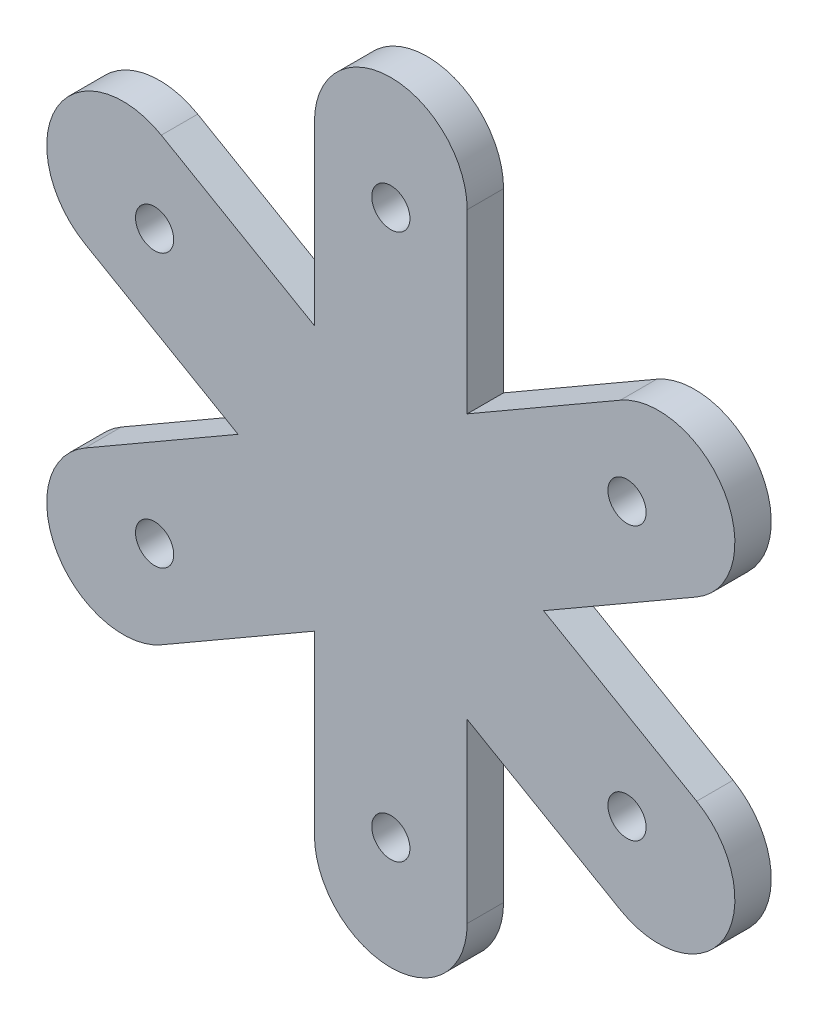
ISO-10303-21;
HEADER;
FILE_DESCRIPTION(('STEP AP214'),'2;1');
FILE_NAME('part.step','',(''),(''),'','','');
FILE_SCHEMA(('AUTOMOTIVE_DESIGN { 1 0 10303 214 1 1 1 1 }'));
ENDSEC;
DATA;
#1=APPLICATION_CONTEXT('core data for automotive mechanical design processes');
#2=APPLICATION_PROTOCOL_DEFINITION('international standard','automotive_design',2000,#1);
#3=PRODUCT_CONTEXT('',#1,'mechanical');
#4=PRODUCT('Part','Part','',(#3));
#5=PRODUCT_RELATED_PRODUCT_CATEGORY('part','',(#4));
#6=PRODUCT_DEFINITION_FORMATION('','',#4);
#7=PRODUCT_DEFINITION_CONTEXT('part definition',#1,'design');
#8=PRODUCT_DEFINITION('design','',#6,#7);
#9=PRODUCT_DEFINITION_SHAPE('','',#8);
#10=(LENGTH_UNIT() NAMED_UNIT(*) SI_UNIT(.MILLI.,.METRE.));
#11=(NAMED_UNIT(*) PLANE_ANGLE_UNIT() SI_UNIT($,.RADIAN.));
#12=(NAMED_UNIT(*) SI_UNIT($,.STERADIAN.) SOLID_ANGLE_UNIT());
#13=UNCERTAINTY_MEASURE_WITH_UNIT(LENGTH_MEASURE(1.E-05),#10,'distance_accuracy_value','');
#14=(GEOMETRIC_REPRESENTATION_CONTEXT(3) GLOBAL_UNCERTAINTY_ASSIGNED_CONTEXT((#13)) GLOBAL_UNIT_ASSIGNED_CONTEXT((#10,
#11,#12)) REPRESENTATION_CONTEXT('',''));
#15=CARTESIAN_POINT('',(0.,0.,0.));
#16=DIRECTION('',(0.,0.,1.));
#17=DIRECTION('',(1.,0.,0.));
#18=AXIS2_PLACEMENT_3D('',#15,#16,#17);
#19=CARTESIAN_POINT('',(-26.3060796608391,-45.5634665205264,10.));
#20=DIRECTION('',(0.50000000000001,0.866025403784433,0.));
#21=DIRECTION('',(-0.866025403784433,0.50000000000001,0.));
#22=AXIS2_PLACEMENT_3D('',#19,#20,#21);
#23=PLANE('',#22);
#24=DIRECTION('',(0.866025403784433,-0.50000000000001,0.));
#25=VECTOR('',#24,1.);
#26=CARTESIAN_POINT('',(-26.3060796608391,-45.5634665205264,0.));
#27=LINE('',#26,#25);
#28=CARTESIAN_POINT('',(-63.1121593216767,-24.3134665205265,0.));
#29=VERTEX_POINT('',#28);
#30=CARTESIAN_POINT('',(-21.,-48.6269330410536,0.));
#31=VERTEX_POINT('',#30);
#32=EDGE_CURVE('E217',#29,#31,#27,.T.);
#33=ORIENTED_EDGE('',*,*,#32,.F.);
#34=DIRECTION('',(0.,0.,-1.));
#35=VECTOR('',#34,1.);
#36=CARTESIAN_POINT('',(-63.1121593216767,-24.3134665205265,10.));
#37=LINE('',#36,#35);
#38=CARTESIAN_POINT('',(-63.1121593216767,-24.3134665205265,10.));
#39=VERTEX_POINT('',#38);
#40=EDGE_CURVE('E11',#39,#29,#37,.T.);
#41=ORIENTED_EDGE('',*,*,#40,.F.);
#42=DIRECTION('',(0.866025403784433,-0.50000000000001,0.));
#43=VECTOR('',#42,1.);
#44=CARTESIAN_POINT('',(-26.3060796608391,-45.5634665205264,10.));
#45=LINE('',#44,#43);
#46=CARTESIAN_POINT('',(-21.,-48.6269330410536,10.));
#47=VERTEX_POINT('',#46);
#48=EDGE_CURVE('E624',#39,#47,#45,.T.);
#49=ORIENTED_EDGE('',*,*,#48,.T.);
#50=DIRECTION('',(0.,0.,-1.));
#51=VECTOR('',#50,1.);
#52=CARTESIAN_POINT('',(-21.,-48.6269330410536,10.));
#53=LINE('',#52,#51);
#54=EDGE_CURVE('E123',#47,#31,#53,.T.);
#55=ORIENTED_EDGE('',*,*,#54,.T.);
#56=EDGE_LOOP('',(#33,#41,#49,#55));
#57=FACE_BOUND('',#56,.T.);
#58=ADVANCED_FACE('F41',(#57),#23,.T.);
#59=CARTESIAN_POINT('',(-73.6121593216769,-42.4999999999996,10.));
#60=DIRECTION('',(0.,0.,-1.));
#61=DIRECTION('',(-1.,0.,0.));
#62=AXIS2_PLACEMENT_3D('',#59,#60,#61);
#63=CYLINDRICAL_SURFACE('',#62,21.);
#64=CARTESIAN_POINT('',(-73.6121593216769,-42.4999999999996,0.));
#65=DIRECTION('',(0.,0.,1.));
#66=DIRECTION('',(1.,0.,0.));
#67=AXIS2_PLACEMENT_3D('',#64,#65,#66);
#68=CIRCLE('',#67,21.);
#69=CARTESIAN_POINT('',(-84.1121593216771,-60.6865334794727,0.));
#70=VERTEX_POINT('',#69);
#71=EDGE_CURVE('E219',#29,#70,#68,.T.);
#72=ORIENTED_EDGE('',*,*,#71,.T.);
#73=DIRECTION('',(0.,0.,-1.));
#74=VECTOR('',#73,1.);
#75=CARTESIAN_POINT('',(-84.1121593216771,-60.6865334794727,10.));
#76=LINE('',#75,#74);
#77=CARTESIAN_POINT('',(-84.1121593216771,-60.6865334794727,10.));
#78=VERTEX_POINT('',#77);
#79=EDGE_CURVE('E50',#78,#70,#76,.T.);
#80=ORIENTED_EDGE('',*,*,#79,.F.);
#81=CARTESIAN_POINT('',(-73.6121593216769,-42.4999999999996,10.));
#82=DIRECTION('',(0.,0.,1.));
#83=DIRECTION('',(1.,0.,0.));
#84=AXIS2_PLACEMENT_3D('',#81,#82,#83);
#85=CIRCLE('',#84,21.);
#86=EDGE_CURVE('E582',#39,#78,#85,.T.);
#87=ORIENTED_EDGE('',*,*,#86,.F.);
#88=ORIENTED_EDGE('',*,*,#40,.T.);
#89=EDGE_LOOP('',(#72,#80,#87,#88));
#90=FACE_BOUND('',#89,.T.);
#91=ADVANCED_FACE('F305',(#90),#63,.T.);
#92=CARTESIAN_POINT('',(-47.3060796608396,-81.9365334794726,10.));
#93=DIRECTION('',(0.50000000000001,0.866025403784433,0.));
#94=DIRECTION('',(-0.866025403784433,0.50000000000001,0.));
#95=AXIS2_PLACEMENT_3D('',#92,#93,#94);
#96=PLANE('',#95);
#97=DIRECTION('',(0.866025403784433,-0.50000000000001,0.));
#98=VECTOR('',#97,1.);
#99=CARTESIAN_POINT('',(-47.3060796608396,-81.9365334794726,0.));
#100=LINE('',#99,#98);
#101=CARTESIAN_POINT('',(-41.9999999999996,-85.0000000000002,0.));
#102=VERTEX_POINT('',#101);
#103=EDGE_CURVE('E222',#70,#102,#100,.T.);
#104=ORIENTED_EDGE('',*,*,#103,.T.);
#105=DIRECTION('',(0.,0.,-1.));
#106=VECTOR('',#105,1.);
#107=CARTESIAN_POINT('',(-41.9999999999996,-85.0000000000002,10.));
#108=LINE('',#107,#106);
#109=CARTESIAN_POINT('',(-41.9999999999996,-85.0000000000002,10.));
#110=VERTEX_POINT('',#109);
#111=EDGE_CURVE('E295',#110,#102,#108,.T.);
#112=ORIENTED_EDGE('',*,*,#111,.F.);
#113=DIRECTION('',(0.866025403784433,-0.50000000000001,0.));
#114=VECTOR('',#113,1.);
#115=CARTESIAN_POINT('',(-47.3060796608396,-81.9365334794726,10.));
#116=LINE('',#115,#114);
#117=EDGE_CURVE('E301',#78,#110,#116,.T.);
#118=ORIENTED_EDGE('',*,*,#117,.F.);
#119=ORIENTED_EDGE('',*,*,#79,.T.);
#120=EDGE_LOOP('',(#104,#112,#118,#119));
#121=FACE_BOUND('',#120,.T.);
#122=ADVANCED_FACE('F299',(#121),#96,.F.);
#123=CARTESIAN_POINT('',(26.3060796608388,-45.563466520528,10.));
#124=DIRECTION('',(-0.499999999999992,0.866025403784443,0.));
#125=DIRECTION('',(-0.866025403784443,-0.499999999999992,0.));
#126=AXIS2_PLACEMENT_3D('',#123,#124,#125);
#127=PLANE('',#126);
#128=DIRECTION('',(0.866025403784443,0.499999999999992,0.));
#129=VECTOR('',#128,1.);
#130=CARTESIAN_POINT('',(26.3060796608388,-45.563466520528,0.));
#131=LINE('',#130,#129);
#132=CARTESIAN_POINT('',(-84.1121593216773,-109.313466520527,0.));
#133=VERTEX_POINT('',#132);
#134=EDGE_CURVE('E225',#133,#102,#131,.T.);
#135=ORIENTED_EDGE('',*,*,#134,.F.);
#136=DIRECTION('',(0.,0.,-1.));
#137=VECTOR('',#136,1.);
#138=CARTESIAN_POINT('',(-84.1121593216773,-109.313466520527,10.));
#139=LINE('',#138,#137);
#140=CARTESIAN_POINT('',(-84.1121593216773,-109.313466520527,10.));
#141=VERTEX_POINT('',#140);
#142=EDGE_CURVE('E293',#141,#133,#139,.T.);
#143=ORIENTED_EDGE('',*,*,#142,.F.);
#144=DIRECTION('',(0.866025403784443,0.499999999999992,0.));
#145=VECTOR('',#144,1.);
#146=CARTESIAN_POINT('',(26.3060796608388,-45.563466520528,10.));
#147=LINE('',#146,#145);
#148=EDGE_CURVE('E579',#141,#110,#147,.T.);
#149=ORIENTED_EDGE('',*,*,#148,.T.);
#150=ORIENTED_EDGE('',*,*,#111,.T.);
#151=EDGE_LOOP('',(#135,#143,#149,#150));
#152=FACE_BOUND('',#151,.T.);
#153=ADVANCED_FACE('F415',(#152),#127,.T.);
#154=CARTESIAN_POINT('',(-73.6121593216775,-127.5,10.));
#155=DIRECTION('',(0.,0.,-1.));
#156=DIRECTION('',(-1.,0.,0.));
#157=AXIS2_PLACEMENT_3D('',#154,#155,#156);
#158=CYLINDRICAL_SURFACE('',#157,21.);
#159=CARTESIAN_POINT('',(-73.6121593216775,-127.5,0.));
#160=DIRECTION('',(0.,0.,1.));
#161=DIRECTION('',(1.,0.,0.));
#162=AXIS2_PLACEMENT_3D('',#159,#160,#161);
#163=CIRCLE('',#162,21.);
#164=CARTESIAN_POINT('',(-63.1121593216776,-145.686533479473,0.));
#165=VERTEX_POINT('',#164);
#166=EDGE_CURVE('E228',#133,#165,#163,.T.);
#167=ORIENTED_EDGE('',*,*,#166,.T.);
#168=DIRECTION('',(0.,0.,-1.));
#169=VECTOR('',#168,1.);
#170=CARTESIAN_POINT('',(-63.1121593216776,-145.686533479473,10.));
#171=LINE('',#170,#169);
#172=CARTESIAN_POINT('',(-63.1121593216776,-145.686533479473,10.));
#173=VERTEX_POINT('',#172);
#174=EDGE_CURVE('E290',#173,#165,#171,.T.);
#175=ORIENTED_EDGE('',*,*,#174,.F.);
#176=CARTESIAN_POINT('',(-73.6121593216775,-127.5,10.));
#177=DIRECTION('',(0.,0.,1.));
#178=DIRECTION('',(1.,0.,0.));
#179=AXIS2_PLACEMENT_3D('',#176,#177,#178);
#180=CIRCLE('',#179,21.);
#181=EDGE_CURVE('E576',#141,#173,#180,.T.);
#182=ORIENTED_EDGE('',*,*,#181,.F.);
#183=ORIENTED_EDGE('',*,*,#142,.T.);
#184=EDGE_LOOP('',(#167,#175,#182,#183));
#185=FACE_BOUND('',#184,.T.);
#186=ADVANCED_FACE('F411',(#185),#158,.T.);
#187=CARTESIAN_POINT('',(47.3060796608384,-81.9365334794746,10.));
#188=DIRECTION('',(-0.499999999999992,0.866025403784443,0.));
#189=DIRECTION('',(-0.866025403784443,-0.499999999999992,0.));
#190=AXIS2_PLACEMENT_3D('',#187,#188,#189);
#191=PLANE('',#190);
#192=DIRECTION('',(0.866025403784443,0.499999999999992,0.));
#193=VECTOR('',#192,1.);
#194=CARTESIAN_POINT('',(47.3060796608384,-81.9365334794746,0.));
#195=LINE('',#194,#193);
#196=CARTESIAN_POINT('',(-20.9999999999996,-121.373066958947,0.));
#197=VERTEX_POINT('',#196);
#198=EDGE_CURVE('E231',#165,#197,#195,.T.);
#199=ORIENTED_EDGE('',*,*,#198,.T.);
#200=DIRECTION('',(0.,0.,-1.));
#201=VECTOR('',#200,1.);
#202=CARTESIAN_POINT('',(-20.9999999999996,-121.373066958947,10.));
#203=LINE('',#202,#201);
#204=CARTESIAN_POINT('',(-20.9999999999996,-121.373066958947,10.));
#205=VERTEX_POINT('',#204);
#206=EDGE_CURVE('E288',#205,#197,#203,.T.);
#207=ORIENTED_EDGE('',*,*,#206,.F.);
#208=DIRECTION('',(0.866025403784443,0.499999999999992,0.));
#209=VECTOR('',#208,1.);
#210=CARTESIAN_POINT('',(47.3060796608384,-81.9365334794746,10.));
#211=LINE('',#210,#209);
#212=EDGE_CURVE('E578',#173,#205,#211,.T.);
#213=ORIENTED_EDGE('',*,*,#212,.F.);
#214=ORIENTED_EDGE('',*,*,#174,.T.);
#215=EDGE_LOOP('',(#199,#207,#213,#214));
#216=FACE_BOUND('',#215,.T.);
#217=ADVANCED_FACE('F407',(#216),#191,.F.);
#218=CARTESIAN_POINT('',(-20.9999999999988,1.45336401026207E-13,10.));
#219=DIRECTION('',(-1.,0.,0.));
#220=DIRECTION('',(0.,-1.,0.));
#221=AXIS2_PLACEMENT_3D('',#218,#219,#220);
#222=PLANE('',#221);
#223=DIRECTION('',(0.,1.,0.));
#224=VECTOR('',#223,1.);
#225=CARTESIAN_POINT('',(-20.9999999999988,1.45336401026207E-13,0.));
#226=LINE('',#225,#224);
#227=CARTESIAN_POINT('',(-21.,-170.,0.));
#228=VERTEX_POINT('',#227);
#229=EDGE_CURVE('E234',#228,#197,#226,.T.);
#230=ORIENTED_EDGE('',*,*,#229,.F.);
#231=DIRECTION('',(0.,0.,-1.));
#232=VECTOR('',#231,1.);
#233=CARTESIAN_POINT('',(-21.,-170.,10.));
#234=LINE('',#233,#232);
#235=CARTESIAN_POINT('',(-21.,-170.,10.));
#236=VERTEX_POINT('',#235);
#237=EDGE_CURVE('E286',#236,#228,#234,.T.);
#238=ORIENTED_EDGE('',*,*,#237,.F.);
#239=DIRECTION('',(0.,1.,0.));
#240=VECTOR('',#239,1.);
#241=CARTESIAN_POINT('',(-20.9999999999988,1.45336401026207E-13,10.));
#242=LINE('',#241,#240);
#243=EDGE_CURVE('E587',#236,#205,#242,.T.);
#244=ORIENTED_EDGE('',*,*,#243,.T.);
#245=ORIENTED_EDGE('',*,*,#206,.T.);
#246=EDGE_LOOP('',(#230,#238,#244,#245));
#247=FACE_BOUND('',#246,.T.);
#248=ADVANCED_FACE('F403',(#247),#222,.T.);
#249=CARTESIAN_POINT('',(0.,-170.000000000001,10.));
#250=DIRECTION('',(0.,0.,-1.));
#251=DIRECTION('',(-1.,0.,0.));
#252=AXIS2_PLACEMENT_3D('',#249,#250,#251);
#253=CYLINDRICAL_SURFACE('',#252,21.);
#254=CARTESIAN_POINT('',(0.,-170.000000000001,0.));
#255=DIRECTION('',(0.,0.,1.));
#256=DIRECTION('',(1.,0.,0.));
#257=AXIS2_PLACEMENT_3D('',#254,#255,#256);
#258=CIRCLE('',#257,21.);
#259=CARTESIAN_POINT('',(21.,-170.000000000001,0.));
#260=VERTEX_POINT('',#259);
#261=EDGE_CURVE('E237',#228,#260,#258,.T.);
#262=ORIENTED_EDGE('',*,*,#261,.T.);
#263=DIRECTION('',(0.,0.,-1.));
#264=VECTOR('',#263,1.);
#265=CARTESIAN_POINT('',(21.,-170.000000000001,10.));
#266=LINE('',#265,#264);
#267=CARTESIAN_POINT('',(21.,-170.000000000001,10.));
#268=VERTEX_POINT('',#267);
#269=EDGE_CURVE('E283',#268,#260,#266,.T.);
#270=ORIENTED_EDGE('',*,*,#269,.F.);
#271=CARTESIAN_POINT('',(0.,-170.000000000001,10.));
#272=DIRECTION('',(0.,0.,1.));
#273=DIRECTION('',(1.,0.,0.));
#274=AXIS2_PLACEMENT_3D('',#271,#272,#273);
#275=CIRCLE('',#274,21.);
#276=EDGE_CURVE('E590',#236,#268,#275,.T.);
#277=ORIENTED_EDGE('',*,*,#276,.F.);
#278=ORIENTED_EDGE('',*,*,#237,.T.);
#279=EDGE_LOOP('',(#262,#270,#277,#278));
#280=FACE_BOUND('',#279,.T.);
#281=ADVANCED_FACE('F399',(#280),#253,.T.);
#282=CARTESIAN_POINT('',(21.0000000000012,-1.45336401026223E-13,10.));
#283=DIRECTION('',(-1.,0.,0.));
#284=DIRECTION('',(0.,-1.,0.));
#285=AXIS2_PLACEMENT_3D('',#282,#283,#284);
#286=PLANE('',#285);
#287=DIRECTION('',(0.,1.,0.));
#288=VECTOR('',#287,1.);
#289=CARTESIAN_POINT('',(21.0000000000012,-1.45336401026223E-13,0.));
#290=LINE('',#289,#288);
#291=CARTESIAN_POINT('',(21.0000000000004,-121.373066958947,0.));
#292=VERTEX_POINT('',#291);
#293=EDGE_CURVE('E240',#260,#292,#290,.T.);
#294=ORIENTED_EDGE('',*,*,#293,.T.);
#295=DIRECTION('',(0.,0.,-1.));
#296=VECTOR('',#295,1.);
#297=CARTESIAN_POINT('',(21.0000000000004,-121.373066958947,10.));
#298=LINE('',#297,#296);
#299=CARTESIAN_POINT('',(21.0000000000004,-121.373066958947,10.));
#300=VERTEX_POINT('',#299);
#301=EDGE_CURVE('E281',#300,#292,#298,.T.);
#302=ORIENTED_EDGE('',*,*,#301,.F.);
#303=DIRECTION('',(0.,1.,0.));
#304=VECTOR('',#303,1.);
#305=CARTESIAN_POINT('',(21.0000000000012,-1.45336401026223E-13,10.));
#306=LINE('',#305,#304);
#307=EDGE_CURVE('E593',#268,#300,#306,.T.);
#308=ORIENTED_EDGE('',*,*,#307,.F.);
#309=ORIENTED_EDGE('',*,*,#269,.T.);
#310=EDGE_LOOP('',(#294,#302,#308,#309));
#311=FACE_BOUND('',#310,.T.);
#312=ADVANCED_FACE('F395',(#311),#286,.F.);
#313=CARTESIAN_POINT('',(-47.3060796608388,-81.9365334794727,10.));
#314=DIRECTION('',(-0.500000000000004,-0.866025403784436,0.));
#315=DIRECTION('',(0.866025403784436,-0.500000000000004,0.));
#316=AXIS2_PLACEMENT_3D('',#313,#314,#315);
#317=PLANE('',#316);
#318=DIRECTION('',(-0.866025403784436,0.500000000000004,0.));
#319=VECTOR('',#318,1.);
#320=CARTESIAN_POINT('',(-47.3060796608388,-81.9365334794727,0.));
#321=LINE('',#320,#319);
#322=CARTESIAN_POINT('',(63.1121593216778,-145.686533479474,0.));
#323=VERTEX_POINT('',#322);
#324=EDGE_CURVE('E243',#323,#292,#321,.T.);
#325=ORIENTED_EDGE('',*,*,#324,.F.);
#326=DIRECTION('',(0.,0.,-1.));
#327=VECTOR('',#326,1.);
#328=CARTESIAN_POINT('',(63.1121593216778,-145.686533479474,10.));
#329=LINE('',#328,#327);
#330=CARTESIAN_POINT('',(63.1121593216778,-145.686533479474,10.));
#331=VERTEX_POINT('',#330);
#332=EDGE_CURVE('E279',#331,#323,#329,.T.);
#333=ORIENTED_EDGE('',*,*,#332,.F.);
#334=DIRECTION('',(-0.866025403784436,0.500000000000004,0.));
#335=VECTOR('',#334,1.);
#336=CARTESIAN_POINT('',(-47.3060796608388,-81.9365334794727,10.));
#337=LINE('',#336,#335);
#338=EDGE_CURVE('E595',#331,#300,#337,.T.);
#339=ORIENTED_EDGE('',*,*,#338,.T.);
#340=ORIENTED_EDGE('',*,*,#301,.T.);
#341=EDGE_LOOP('',(#325,#333,#339,#340));
#342=FACE_BOUND('',#341,.T.);
#343=ADVANCED_FACE('F391',(#342),#317,.T.);
#344=CARTESIAN_POINT('',(73.6121593216779,-127.500000000001,10.));
#345=DIRECTION('',(0.,0.,-1.));
#346=DIRECTION('',(-1.,0.,0.));
#347=AXIS2_PLACEMENT_3D('',#344,#345,#346);
#348=CYLINDRICAL_SURFACE('',#347,21.);
#349=CARTESIAN_POINT('',(73.6121593216779,-127.500000000001,0.));
#350=DIRECTION('',(0.,0.,1.));
#351=DIRECTION('',(1.,0.,0.));
#352=AXIS2_PLACEMENT_3D('',#349,#350,#351);
#353=CIRCLE('',#352,21.);
#354=CARTESIAN_POINT('',(84.112159321678,-109.313466520527,0.));
#355=VERTEX_POINT('',#354);
#356=EDGE_CURVE('E246',#323,#355,#353,.T.);
#357=ORIENTED_EDGE('',*,*,#356,.T.);
#358=DIRECTION('',(0.,0.,-1.));
#359=VECTOR('',#358,1.);
#360=CARTESIAN_POINT('',(84.112159321678,-109.313466520527,10.));
#361=LINE('',#360,#359);
#362=CARTESIAN_POINT('',(84.112159321678,-109.313466520527,10.));
#363=VERTEX_POINT('',#362);
#364=EDGE_CURVE('E276',#363,#355,#361,.T.);
#365=ORIENTED_EDGE('',*,*,#364,.F.);
#366=CARTESIAN_POINT('',(73.6121593216779,-127.500000000001,10.));
#367=DIRECTION('',(0.,0.,1.));
#368=DIRECTION('',(1.,0.,0.));
#369=AXIS2_PLACEMENT_3D('',#366,#367,#368);
#370=CIRCLE('',#369,21.);
#371=EDGE_CURVE('E598',#331,#363,#370,.T.);
#372=ORIENTED_EDGE('',*,*,#371,.F.);
#373=ORIENTED_EDGE('',*,*,#332,.T.);
#374=EDGE_LOOP('',(#357,#365,#372,#373));
#375=FACE_BOUND('',#374,.T.);
#376=ADVANCED_FACE('F387',(#375),#348,.T.);
#377=CARTESIAN_POINT('',(-26.3060796608387,-45.5634665205263,10.));
#378=DIRECTION('',(-0.500000000000004,-0.866025403784436,0.));
#379=DIRECTION('',(0.866025403784436,-0.500000000000004,0.));
#380=AXIS2_PLACEMENT_3D('',#377,#378,#379);
#381=PLANE('',#380);
#382=DIRECTION('',(-0.866025403784436,0.500000000000004,0.));
#383=VECTOR('',#382,1.);
#384=CARTESIAN_POINT('',(-26.3060796608387,-45.5634665205263,0.));
#385=LINE('',#384,#383);
#386=CARTESIAN_POINT('',(42.0000000000003,-85.0000000000001,0.));
#387=VERTEX_POINT('',#386);
#388=EDGE_CURVE('E249',#355,#387,#385,.T.);
#389=ORIENTED_EDGE('',*,*,#388,.T.);
#390=DIRECTION('',(0.,0.,-1.));
#391=VECTOR('',#390,1.);
#392=CARTESIAN_POINT('',(42.0000000000003,-85.0000000000001,10.));
#393=LINE('',#392,#391);
#394=CARTESIAN_POINT('',(42.0000000000003,-85.0000000000001,10.));
#395=VERTEX_POINT('',#394);
#396=EDGE_CURVE('E274',#395,#387,#393,.T.);
#397=ORIENTED_EDGE('',*,*,#396,.F.);
#398=DIRECTION('',(-0.866025403784436,0.500000000000004,0.));
#399=VECTOR('',#398,1.);
#400=CARTESIAN_POINT('',(-26.3060796608387,-45.5634665205263,10.));
#401=LINE('',#400,#399);
#402=EDGE_CURVE('E601',#363,#395,#401,.T.);
#403=ORIENTED_EDGE('',*,*,#402,.F.);
#404=ORIENTED_EDGE('',*,*,#364,.T.);
#405=EDGE_LOOP('',(#389,#397,#403,#404));
#406=FACE_BOUND('',#405,.T.);
#407=ADVANCED_FACE('F383',(#406),#381,.F.);
#408=CARTESIAN_POINT('',(47.3060796608386,-81.9365334794735,10.));
#409=DIRECTION('',(0.499999999999998,-0.86602540378444,0.));
#410=DIRECTION('',(0.86602540378444,0.499999999999998,0.));
#411=AXIS2_PLACEMENT_3D('',#408,#409,#410);
#412=PLANE('',#411);
#413=DIRECTION('',(-0.86602540378444,-0.499999999999998,0.));
#414=VECTOR('',#413,1.);
#415=CARTESIAN_POINT('',(47.3060796608386,-81.9365334794735,0.));
#416=LINE('',#415,#414);
#417=CARTESIAN_POINT('',(84.1121593216778,-60.6865334794733,0.));
#418=VERTEX_POINT('',#417);
#419=EDGE_CURVE('E252',#418,#387,#416,.T.);
#420=ORIENTED_EDGE('',*,*,#419,.F.);
#421=DIRECTION('',(0.,0.,-1.));
#422=VECTOR('',#421,1.);
#423=CARTESIAN_POINT('',(84.1121593216778,-60.6865334794733,10.));
#424=LINE('',#423,#422);
#425=CARTESIAN_POINT('',(84.1121593216778,-60.6865334794733,10.));
#426=VERTEX_POINT('',#425);
#427=EDGE_CURVE('E272',#426,#418,#424,.T.);
#428=ORIENTED_EDGE('',*,*,#427,.F.);
#429=DIRECTION('',(-0.86602540378444,-0.499999999999998,0.));
#430=VECTOR('',#429,1.);
#431=CARTESIAN_POINT('',(47.3060796608386,-81.9365334794735,10.));
#432=LINE('',#431,#430);
#433=EDGE_CURVE('E603',#426,#395,#432,.T.);
#434=ORIENTED_EDGE('',*,*,#433,.T.);
#435=ORIENTED_EDGE('',*,*,#396,.T.);
#436=EDGE_LOOP('',(#420,#428,#434,#435));
#437=FACE_BOUND('',#436,.T.);
#438=ADVANCED_FACE('F379',(#437),#412,.T.);
#439=CARTESIAN_POINT('',(73.6121593216778,-42.5000000000001,10.));
#440=DIRECTION('',(0.,0.,-1.));
#441=DIRECTION('',(-1.,0.,0.));
#442=AXIS2_PLACEMENT_3D('',#439,#440,#441);
#443=CYLINDRICAL_SURFACE('',#442,21.);
#444=CARTESIAN_POINT('',(73.6121593216778,-42.5000000000001,0.));
#445=DIRECTION('',(0.,0.,1.));
#446=DIRECTION('',(1.,0.,0.));
#447=AXIS2_PLACEMENT_3D('',#444,#445,#446);
#448=CIRCLE('',#447,21.);
#449=CARTESIAN_POINT('',(63.1121593216779,-24.3134665205268,0.));
#450=VERTEX_POINT('',#449);
#451=EDGE_CURVE('E255',#418,#450,#448,.T.);
#452=ORIENTED_EDGE('',*,*,#451,.T.);
#453=DIRECTION('',(0.,0.,-1.));
#454=VECTOR('',#453,1.);
#455=CARTESIAN_POINT('',(63.1121593216779,-24.3134665205268,10.));
#456=LINE('',#455,#454);
#457=CARTESIAN_POINT('',(63.1121593216779,-24.3134665205268,10.));
#458=VERTEX_POINT('',#457);
#459=EDGE_CURVE('E269',#458,#450,#456,.T.);
#460=ORIENTED_EDGE('',*,*,#459,.F.);
#461=CARTESIAN_POINT('',(73.6121593216778,-42.5000000000001,10.));
#462=DIRECTION('',(0.,0.,1.));
#463=DIRECTION('',(1.,0.,0.));
#464=AXIS2_PLACEMENT_3D('',#461,#462,#463);
#465=CIRCLE('',#464,21.);
#466=EDGE_CURVE('E194',#426,#458,#465,.T.);
#467=ORIENTED_EDGE('',*,*,#466,.F.);
#468=ORIENTED_EDGE('',*,*,#427,.T.);
#469=EDGE_LOOP('',(#452,#460,#467,#468));
#470=FACE_BOUND('',#469,.T.);
#471=ADVANCED_FACE('F375',(#470),#443,.T.);
#472=CARTESIAN_POINT('',(26.3060796608387,-45.563466520527,10.));
#473=DIRECTION('',(0.499999999999998,-0.86602540378444,0.));
#474=DIRECTION('',(0.86602540378444,0.499999999999998,0.));
#475=AXIS2_PLACEMENT_3D('',#472,#473,#474);
#476=PLANE('',#475);
#477=DIRECTION('',(-0.86602540378444,-0.499999999999998,0.));
#478=VECTOR('',#477,1.);
#479=CARTESIAN_POINT('',(26.3060796608387,-45.563466520527,0.));
#480=LINE('',#479,#478);
#481=CARTESIAN_POINT('',(21.,-48.6269330410538,0.));
#482=VERTEX_POINT('',#481);
#483=EDGE_CURVE('E258',#450,#482,#480,.T.);
#484=ORIENTED_EDGE('',*,*,#483,.T.);
#485=DIRECTION('',(0.,0.,-1.));
#486=VECTOR('',#485,1.);
#487=CARTESIAN_POINT('',(21.,-48.6269330410538,10.));
#488=LINE('',#487,#486);
#489=CARTESIAN_POINT('',(21.,-48.6269330410538,10.));
#490=VERTEX_POINT('',#489);
#491=EDGE_CURVE('E182',#490,#482,#488,.T.);
#492=ORIENTED_EDGE('',*,*,#491,.F.);
#493=DIRECTION('',(-0.86602540378444,-0.499999999999998,0.));
#494=VECTOR('',#493,1.);
#495=CARTESIAN_POINT('',(26.3060796608387,-45.563466520527,10.));
#496=LINE('',#495,#494);
#497=EDGE_CURVE('E191',#458,#490,#496,.T.);
#498=ORIENTED_EDGE('',*,*,#497,.F.);
#499=ORIENTED_EDGE('',*,*,#459,.T.);
#500=EDGE_LOOP('',(#484,#492,#498,#499));
#501=FACE_BOUND('',#500,.T.);
#502=ADVANCED_FACE('F372',(#501),#476,.F.);
#503=CARTESIAN_POINT('',(21.,0.,10.));
#504=DIRECTION('',(1.,0.,0.));
#505=DIRECTION('',(0.,1.,0.));
#506=AXIS2_PLACEMENT_3D('',#503,#504,#505);
#507=PLANE('',#506);
#508=DIRECTION('',(0.,-1.,0.));
#509=VECTOR('',#508,1.);
#510=CARTESIAN_POINT('',(21.,0.,0.));
#511=LINE('',#510,#509);
#512=CARTESIAN_POINT('',(21.,0.,0.));
#513=VERTEX_POINT('',#512);
#514=EDGE_CURVE('E179',#513,#482,#511,.T.);
#515=ORIENTED_EDGE('',*,*,#514,.F.);
#516=DIRECTION('',(0.,0.,-1.));
#517=VECTOR('',#516,1.);
#518=CARTESIAN_POINT('',(21.,0.,10.));
#519=LINE('',#518,#517);
#520=CARTESIAN_POINT('',(21.,0.,10.));
#521=VERTEX_POINT('',#520);
#522=EDGE_CURVE('E173',#521,#513,#519,.T.);
#523=ORIENTED_EDGE('',*,*,#522,.F.);
#524=DIRECTION('',(0.,-1.,0.));
#525=VECTOR('',#524,1.);
#526=CARTESIAN_POINT('',(21.,0.,10.));
#527=LINE('',#526,#525);
#528=EDGE_CURVE('E177',#521,#490,#527,.T.);
#529=ORIENTED_EDGE('',*,*,#528,.T.);
#530=ORIENTED_EDGE('',*,*,#491,.T.);
#531=EDGE_LOOP('',(#515,#523,#529,#530));
#532=FACE_BOUND('',#531,.T.);
#533=ADVANCED_FACE('F175',(#532),#507,.T.);
#534=CARTESIAN_POINT('',(0.,0.,10.));
#535=DIRECTION('',(0.,0.,-1.));
#536=DIRECTION('',(-1.,0.,0.));
#537=AXIS2_PLACEMENT_3D('',#534,#535,#536);
#538=CYLINDRICAL_SURFACE('',#537,21.);
#539=CARTESIAN_POINT('',(0.,0.,0.));
#540=DIRECTION('',(0.,0.,1.));
#541=DIRECTION('',(1.,0.,0.));
#542=AXIS2_PLACEMENT_3D('',#539,#540,#541);
#543=CIRCLE('',#542,21.);
#544=CARTESIAN_POINT('',(-21.,0.,0.));
#545=VERTEX_POINT('',#544);
#546=EDGE_CURVE('E262',#513,#545,#543,.T.);
#547=ORIENTED_EDGE('',*,*,#546,.T.);
#548=DIRECTION('',(0.,0.,-1.));
#549=VECTOR('',#548,1.);
#550=CARTESIAN_POINT('',(-21.,0.,10.));
#551=LINE('',#550,#549);
#552=CARTESIAN_POINT('',(-21.,0.,10.));
#553=VERTEX_POINT('',#552);
#554=EDGE_CURVE('E183',#553,#545,#551,.T.);
#555=ORIENTED_EDGE('',*,*,#554,.F.);
#556=CARTESIAN_POINT('',(0.,0.,10.));
#557=DIRECTION('',(0.,0.,1.));
#558=DIRECTION('',(1.,0.,0.));
#559=AXIS2_PLACEMENT_3D('',#556,#557,#558);
#560=CIRCLE('',#559,21.);
#561=EDGE_CURVE('E186',#521,#553,#560,.T.);
#562=ORIENTED_EDGE('',*,*,#561,.F.);
#563=ORIENTED_EDGE('',*,*,#522,.T.);
#564=EDGE_LOOP('',(#547,#555,#562,#563));
#565=FACE_BOUND('',#564,.T.);
#566=ADVANCED_FACE('F187',(#565),#538,.T.);
#567=CARTESIAN_POINT('',(64.9519052838346,-47.4999999999974,10.));
#568=DIRECTION('',(0.,0.,-1.));
#569=DIRECTION('',(-1.,0.,0.));
#570=AXIS2_PLACEMENT_3D('',#567,#568,#569);
#571=CYLINDRICAL_SURFACE('',#570,5.25);
#572=CARTESIAN_POINT('',(64.9519052838346,-47.4999999999974,10.));
#573=DIRECTION('',(0.,0.,1.));
#574=DIRECTION('',(1.,0.,0.));
#575=AXIS2_PLACEMENT_3D('',#572,#573,#574);
#576=CIRCLE('',#575,5.25);
#577=CARTESIAN_POINT('',(70.2019052838346,-47.4999999999974,10.));
#578=VERTEX_POINT('',#577);
#579=EDGE_CURVE('E626',#578,#578,#576,.T.);
#580=ORIENTED_EDGE('',*,*,#579,.T.);
#581=EDGE_LOOP('',(#580));
#582=FACE_BOUND('',#581,.T.);
#583=CARTESIAN_POINT('',(64.9519052838346,-47.4999999999974,0.));
#584=DIRECTION('',(0.,0.,1.));
#585=DIRECTION('',(1.,0.,0.));
#586=AXIS2_PLACEMENT_3D('',#583,#584,#585);
#587=CIRCLE('',#586,5.25);
#588=CARTESIAN_POINT('',(70.2019052838346,-47.4999999999974,0.));
#589=VERTEX_POINT('',#588);
#590=EDGE_CURVE('E214',#589,#589,#587,.T.);
#591=ORIENTED_EDGE('',*,*,#590,.F.);
#592=EDGE_LOOP('',(#591));
#593=FACE_BOUND('',#592,.T.);
#594=ADVANCED_FACE('F315',(#582,#593),#571,.F.);
#595=CARTESIAN_POINT('',(64.9519052838375,-122.499999999998,10.));
#596=DIRECTION('',(0.,0.,-1.));
#597=DIRECTION('',(-1.,0.,0.));
#598=AXIS2_PLACEMENT_3D('',#595,#596,#597);
#599=CYLINDRICAL_SURFACE('',#598,5.25);
#600=CARTESIAN_POINT('',(64.9519052838375,-122.499999999998,10.));
#601=DIRECTION('',(0.,0.,1.));
#602=DIRECTION('',(1.,0.,0.));
#603=AXIS2_PLACEMENT_3D('',#600,#601,#602);
#604=CIRCLE('',#603,5.25);
#605=CARTESIAN_POINT('',(70.2019052838375,-122.499999999998,10.));
#606=VERTEX_POINT('',#605);
#607=EDGE_CURVE('E629',#606,#606,#604,.T.);
#608=ORIENTED_EDGE('',*,*,#607,.T.);
#609=EDGE_LOOP('',(#608));
#610=FACE_BOUND('',#609,.T.);
#611=CARTESIAN_POINT('',(64.9519052838375,-122.499999999998,0.));
#612=DIRECTION('',(0.,0.,1.));
#613=DIRECTION('',(1.,0.,0.));
#614=AXIS2_PLACEMENT_3D('',#611,#612,#613);
#615=CIRCLE('',#614,5.25);
#616=CARTESIAN_POINT('',(70.2019052838375,-122.499999999998,0.));
#617=VERTEX_POINT('',#616);
#618=EDGE_CURVE('E211',#617,#617,#615,.T.);
#619=ORIENTED_EDGE('',*,*,#618,.F.);
#620=EDGE_LOOP('',(#619));
#621=FACE_BOUND('',#620,.T.);
#622=ADVANCED_FACE('F318',(#610,#621),#599,.F.);
#623=CARTESIAN_POINT('',(5.83564766383916E-12,-160.,10.));
#624=DIRECTION('',(0.,0.,-1.));
#625=DIRECTION('',(-1.,0.,0.));
#626=AXIS2_PLACEMENT_3D('',#623,#624,#625);
#627=CYLINDRICAL_SURFACE('',#626,5.25);
#628=CARTESIAN_POINT('',(5.83564766383916E-12,-160.,10.));
#629=DIRECTION('',(0.,0.,1.));
#630=DIRECTION('',(1.,0.,0.));
#631=AXIS2_PLACEMENT_3D('',#628,#629,#630);
#632=CIRCLE('',#631,5.25);
#633=CARTESIAN_POINT('',(5.25000000000584,-160.,10.));
#634=VERTEX_POINT('',#633);
#635=EDGE_CURVE('E632',#634,#634,#632,.T.);
#636=ORIENTED_EDGE('',*,*,#635,.T.);
#637=EDGE_LOOP('',(#636));
#638=FACE_BOUND('',#637,.T.);
#639=CARTESIAN_POINT('',(5.83564766383916E-12,-160.,0.));
#640=DIRECTION('',(0.,0.,1.));
#641=DIRECTION('',(1.,0.,0.));
#642=AXIS2_PLACEMENT_3D('',#639,#640,#641);
#643=CIRCLE('',#642,5.25);
#644=CARTESIAN_POINT('',(5.25000000000584,-160.,0.));
#645=VERTEX_POINT('',#644);
#646=EDGE_CURVE('E208',#645,#645,#643,.T.);
#647=ORIENTED_EDGE('',*,*,#646,.F.);
#648=EDGE_LOOP('',(#647));
#649=FACE_BOUND('',#648,.T.);
#650=ADVANCED_FACE('F322',(#638,#649),#627,.F.);
#651=CARTESIAN_POINT('',(-64.9519052838285,-122.500000000002,10.));
#652=DIRECTION('',(0.,0.,-1.));
#653=DIRECTION('',(-1.,0.,0.));
#654=AXIS2_PLACEMENT_3D('',#651,#652,#653);
#655=CYLINDRICAL_SURFACE('',#654,5.25);
#656=CARTESIAN_POINT('',(-64.9519052838285,-122.500000000002,10.));
#657=DIRECTION('',(0.,0.,1.));
#658=DIRECTION('',(1.,0.,0.));
#659=AXIS2_PLACEMENT_3D('',#656,#657,#658);
#660=CIRCLE('',#659,5.25);
#661=CARTESIAN_POINT('',(-59.7019052838284,-122.500000000002,10.));
#662=VERTEX_POINT('',#661);
#663=EDGE_CURVE('E635',#662,#662,#660,.T.);
#664=ORIENTED_EDGE('',*,*,#663,.T.);
#665=EDGE_LOOP('',(#664));
#666=FACE_BOUND('',#665,.T.);
#667=CARTESIAN_POINT('',(-64.9519052838285,-122.500000000002,0.));
#668=DIRECTION('',(0.,0.,1.));
#669=DIRECTION('',(1.,0.,0.));
#670=AXIS2_PLACEMENT_3D('',#667,#668,#669);
#671=CIRCLE('',#670,5.25);
#672=CARTESIAN_POINT('',(-59.7019052838284,-122.500000000002,0.));
#673=VERTEX_POINT('',#672);
#674=EDGE_CURVE('E205',#673,#673,#671,.T.);
#675=ORIENTED_EDGE('',*,*,#674,.F.);
#676=EDGE_LOOP('',(#675));
#677=FACE_BOUND('',#676,.T.);
#678=ADVANCED_FACE('F326',(#666,#677),#655,.F.);
#679=CARTESIAN_POINT('',(-64.9519052838309,-47.500000000002,10.));
#680=DIRECTION('',(0.,0.,-1.));
#681=DIRECTION('',(-1.,0.,0.));
#682=AXIS2_PLACEMENT_3D('',#679,#680,#681);
#683=CYLINDRICAL_SURFACE('',#682,5.25);
#684=CARTESIAN_POINT('',(-64.9519052838309,-47.500000000002,10.));
#685=DIRECTION('',(0.,0.,1.));
#686=DIRECTION('',(1.,0.,0.));
#687=AXIS2_PLACEMENT_3D('',#684,#685,#686);
#688=CIRCLE('',#687,5.25);
#689=CARTESIAN_POINT('',(-59.7019052838309,-47.500000000002,10.));
#690=VERTEX_POINT('',#689);
#691=EDGE_CURVE('E341',#690,#690,#688,.T.);
#692=ORIENTED_EDGE('',*,*,#691,.T.);
#693=EDGE_LOOP('',(#692));
#694=FACE_BOUND('',#693,.T.);
#695=CARTESIAN_POINT('',(-64.9519052838309,-47.500000000002,0.));
#696=DIRECTION('',(0.,0.,1.));
#697=DIRECTION('',(1.,0.,0.));
#698=AXIS2_PLACEMENT_3D('',#695,#696,#697);
#699=CIRCLE('',#698,5.25);
#700=CARTESIAN_POINT('',(-59.7019052838309,-47.500000000002,0.));
#701=VERTEX_POINT('',#700);
#702=EDGE_CURVE('E202',#701,#701,#699,.T.);
#703=ORIENTED_EDGE('',*,*,#702,.F.);
#704=EDGE_LOOP('',(#703));
#705=FACE_BOUND('',#704,.T.);
#706=ADVANCED_FACE('F329',(#694,#705),#683,.F.);
#707=CARTESIAN_POINT('',(0.,-10.,10.));
#708=DIRECTION('',(0.,0.,-1.));
#709=DIRECTION('',(-1.,0.,0.));
#710=AXIS2_PLACEMENT_3D('',#707,#708,#709);
#711=CYLINDRICAL_SURFACE('',#710,5.25);
#712=CARTESIAN_POINT('',(0.,-10.,10.));
#713=DIRECTION('',(0.,0.,1.));
#714=DIRECTION('',(1.,0.,0.));
#715=AXIS2_PLACEMENT_3D('',#712,#713,#714);
#716=CIRCLE('',#715,5.25);
#717=CARTESIAN_POINT('',(5.25,-10.,10.));
#718=VERTEX_POINT('',#717);
#719=EDGE_CURVE('E265',#718,#718,#716,.T.);
#720=ORIENTED_EDGE('',*,*,#719,.T.);
#721=EDGE_LOOP('',(#720));
#722=FACE_BOUND('',#721,.T.);
#723=CARTESIAN_POINT('',(0.,-10.,0.));
#724=DIRECTION('',(0.,0.,1.));
#725=DIRECTION('',(1.,0.,0.));
#726=AXIS2_PLACEMENT_3D('',#723,#724,#725);
#727=CIRCLE('',#726,5.25);
#728=CARTESIAN_POINT('',(5.25,-10.,0.));
#729=VERTEX_POINT('',#728);
#730=EDGE_CURVE('E199',#729,#729,#727,.T.);
#731=ORIENTED_EDGE('',*,*,#730,.F.);
#732=EDGE_LOOP('',(#731));
#733=FACE_BOUND('',#732,.T.);
#734=ADVANCED_FACE('F43',(#722,#733),#711,.F.);
#735=CARTESIAN_POINT('',(-21.,0.,10.));
#736=DIRECTION('',(1.,0.,0.));
#737=DIRECTION('',(0.,1.,0.));
#738=AXIS2_PLACEMENT_3D('',#735,#736,#737);
#739=PLANE('',#738);
#740=DIRECTION('',(0.,-1.,0.));
#741=VECTOR('',#740,1.);
#742=CARTESIAN_POINT('',(-21.,0.,0.));
#743=LINE('',#742,#741);
#744=EDGE_CURVE('E116',#545,#31,#743,.T.);
#745=ORIENTED_EDGE('',*,*,#744,.T.);
#746=ORIENTED_EDGE('',*,*,#54,.F.);
#747=DIRECTION('',(0.,-1.,0.));
#748=VECTOR('',#747,1.);
#749=CARTESIAN_POINT('',(-21.,0.,10.));
#750=LINE('',#749,#748);
#751=EDGE_CURVE('E58',#553,#47,#750,.T.);
#752=ORIENTED_EDGE('',*,*,#751,.F.);
#753=ORIENTED_EDGE('',*,*,#554,.T.);
#754=EDGE_LOOP('',(#745,#746,#752,#753));
#755=FACE_BOUND('',#754,.T.);
#756=ADVANCED_FACE('F336',(#755),#739,.F.);
#757=CARTESIAN_POINT('',(0.,0.,10.));
#758=DIRECTION('',(0.,0.,1.));
#759=DIRECTION('',(1.,0.,0.));
#760=AXIS2_PLACEMENT_3D('',#757,#758,#759);
#761=PLANE('',#760);
#762=ORIENTED_EDGE('',*,*,#719,.F.);
#763=EDGE_LOOP('',(#762));
#764=FACE_BOUND('',#763,.T.);
#765=ORIENTED_EDGE('',*,*,#691,.F.);
#766=EDGE_LOOP('',(#765));
#767=FACE_BOUND('',#766,.T.);
#768=ORIENTED_EDGE('',*,*,#663,.F.);
#769=EDGE_LOOP('',(#768));
#770=FACE_BOUND('',#769,.T.);
#771=ORIENTED_EDGE('',*,*,#635,.F.);
#772=EDGE_LOOP('',(#771));
#773=FACE_BOUND('',#772,.T.);
#774=ORIENTED_EDGE('',*,*,#607,.F.);
#775=EDGE_LOOP('',(#774));
#776=FACE_BOUND('',#775,.T.);
#777=ORIENTED_EDGE('',*,*,#579,.F.);
#778=EDGE_LOOP('',(#777));
#779=FACE_BOUND('',#778,.T.);
#780=ORIENTED_EDGE('',*,*,#48,.F.);
#781=ORIENTED_EDGE('',*,*,#86,.T.);
#782=ORIENTED_EDGE('',*,*,#117,.T.);
#783=ORIENTED_EDGE('',*,*,#148,.F.);
#784=ORIENTED_EDGE('',*,*,#181,.T.);
#785=ORIENTED_EDGE('',*,*,#212,.T.);
#786=ORIENTED_EDGE('',*,*,#243,.F.);
#787=ORIENTED_EDGE('',*,*,#276,.T.);
#788=ORIENTED_EDGE('',*,*,#307,.T.);
#789=ORIENTED_EDGE('',*,*,#338,.F.);
#790=ORIENTED_EDGE('',*,*,#371,.T.);
#791=ORIENTED_EDGE('',*,*,#402,.T.);
#792=ORIENTED_EDGE('',*,*,#433,.F.);
#793=ORIENTED_EDGE('',*,*,#466,.T.);
#794=ORIENTED_EDGE('',*,*,#497,.T.);
#795=ORIENTED_EDGE('',*,*,#528,.F.);
#796=ORIENTED_EDGE('',*,*,#561,.T.);
#797=ORIENTED_EDGE('',*,*,#751,.T.);
#798=EDGE_LOOP('',(#780,#781,#782,#783,#784,#785,#786,#787,#788,#789,#790,#791,#792,#793,#794,
#795,#796,#797));
#799=FACE_BOUND('',#798,.T.);
#800=ADVANCED_FACE('F189',(#764,#767,#770,#773,#776,#779,#799),#761,.T.);
#801=CARTESIAN_POINT('',(0.,0.,0.));
#802=DIRECTION('',(0.,0.,1.));
#803=DIRECTION('',(1.,0.,0.));
#804=AXIS2_PLACEMENT_3D('',#801,#802,#803);
#805=PLANE('',#804);
#806=ORIENTED_EDGE('',*,*,#730,.T.);
#807=EDGE_LOOP('',(#806));
#808=FACE_BOUND('',#807,.T.);
#809=ORIENTED_EDGE('',*,*,#702,.T.);
#810=EDGE_LOOP('',(#809));
#811=FACE_BOUND('',#810,.T.);
#812=ORIENTED_EDGE('',*,*,#674,.T.);
#813=EDGE_LOOP('',(#812));
#814=FACE_BOUND('',#813,.T.);
#815=ORIENTED_EDGE('',*,*,#646,.T.);
#816=EDGE_LOOP('',(#815));
#817=FACE_BOUND('',#816,.T.);
#818=ORIENTED_EDGE('',*,*,#618,.T.);
#819=EDGE_LOOP('',(#818));
#820=FACE_BOUND('',#819,.T.);
#821=ORIENTED_EDGE('',*,*,#590,.T.);
#822=EDGE_LOOP('',(#821));
#823=FACE_BOUND('',#822,.T.);
#824=ORIENTED_EDGE('',*,*,#32,.T.);
#825=ORIENTED_EDGE('',*,*,#744,.F.);
#826=ORIENTED_EDGE('',*,*,#546,.F.);
#827=ORIENTED_EDGE('',*,*,#514,.T.);
#828=ORIENTED_EDGE('',*,*,#483,.F.);
#829=ORIENTED_EDGE('',*,*,#451,.F.);
#830=ORIENTED_EDGE('',*,*,#419,.T.);
#831=ORIENTED_EDGE('',*,*,#388,.F.);
#832=ORIENTED_EDGE('',*,*,#356,.F.);
#833=ORIENTED_EDGE('',*,*,#324,.T.);
#834=ORIENTED_EDGE('',*,*,#293,.F.);
#835=ORIENTED_EDGE('',*,*,#261,.F.);
#836=ORIENTED_EDGE('',*,*,#229,.T.);
#837=ORIENTED_EDGE('',*,*,#198,.F.);
#838=ORIENTED_EDGE('',*,*,#166,.F.);
#839=ORIENTED_EDGE('',*,*,#134,.T.);
#840=ORIENTED_EDGE('',*,*,#103,.F.);
#841=ORIENTED_EDGE('',*,*,#71,.F.);
#842=EDGE_LOOP('',(#824,#825,#826,#827,#828,#829,#830,#831,#832,#833,#834,#835,#836,#837,#838,
#839,#840,#841));
#843=FACE_BOUND('',#842,.T.);
#844=ADVANCED_FACE('F306',(#808,#811,#814,#817,#820,#823,#843),#805,.F.);
#845=CLOSED_SHELL('',(#58,#91,#122,#153,#186,#217,#248,#281,#312,#343,#376,#407,#438,#471,#502,
#533,#566,#594,#622,#650,#678,#706,#734,#756,#800,#844));
#846=MANIFOLD_SOLID_BREP('B2',#845);
#847=ADVANCED_BREP_SHAPE_REPRESENTATION('',(#18,#846),#14);
#848=SHAPE_DEFINITION_REPRESENTATION(#9,#847);
ENDSEC;
END-ISO-10303-21;
